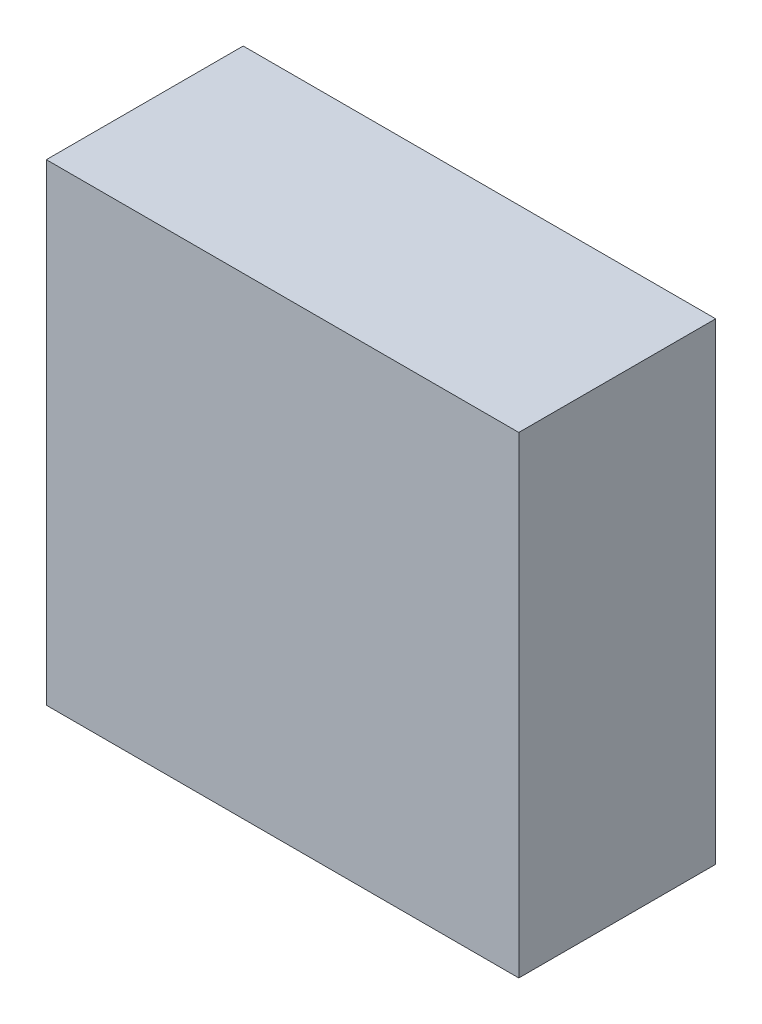
ISO-10303-21;
HEADER;
FILE_DESCRIPTION(('STEP AP214'),'2;1');
FILE_NAME('part.step','',(''),(''),'','','');
FILE_SCHEMA(('AUTOMOTIVE_DESIGN { 1 0 10303 214 1 1 1 1 }'));
ENDSEC;
DATA;
#1=APPLICATION_CONTEXT('core data for automotive mechanical design processes');
#2=APPLICATION_PROTOCOL_DEFINITION('international standard','automotive_design',2000,#1);
#3=PRODUCT_CONTEXT('',#1,'mechanical');
#4=PRODUCT('Part','Part','',(#3));
#5=PRODUCT_RELATED_PRODUCT_CATEGORY('part','',(#4));
#6=PRODUCT_DEFINITION_FORMATION('','',#4);
#7=PRODUCT_DEFINITION_CONTEXT('part definition',#1,'design');
#8=PRODUCT_DEFINITION('design','',#6,#7);
#9=PRODUCT_DEFINITION_SHAPE('','',#8);
#10=(LENGTH_UNIT() NAMED_UNIT(*) SI_UNIT(.MILLI.,.METRE.));
#11=(NAMED_UNIT(*) PLANE_ANGLE_UNIT() SI_UNIT($,.RADIAN.));
#12=(NAMED_UNIT(*) SI_UNIT($,.STERADIAN.) SOLID_ANGLE_UNIT());
#13=UNCERTAINTY_MEASURE_WITH_UNIT(LENGTH_MEASURE(1.E-05),#10,'distance_accuracy_value','');
#14=(GEOMETRIC_REPRESENTATION_CONTEXT(3) GLOBAL_UNCERTAINTY_ASSIGNED_CONTEXT((#13)) GLOBAL_UNIT_ASSIGNED_CONTEXT((#10,
#11,#12)) REPRESENTATION_CONTEXT('',''));
#15=CARTESIAN_POINT('',(0.,0.,0.));
#16=DIRECTION('',(0.,0.,1.));
#17=DIRECTION('',(1.,0.,0.));
#18=AXIS2_PLACEMENT_3D('',#15,#16,#17);
#19=CARTESIAN_POINT('',(0.,0.,25.));
#20=DIRECTION('',(1.,0.,0.));
#21=DIRECTION('',(0.,0.,-1.));
#22=AXIS2_PLACEMENT_3D('',#19,#20,#21);
#23=PLANE('',#22);
#24=DIRECTION('',(0.,-1.,0.));
#25=VECTOR('',#24,1.);
#26=CARTESIAN_POINT('',(0.,0.,0.));
#27=LINE('',#26,#25);
#28=CARTESIAN_POINT('',(0.,60.,0.));
#29=VERTEX_POINT('',#28);
#30=CARTESIAN_POINT('',(0.,0.,0.));
#31=VERTEX_POINT('',#30);
#32=EDGE_CURVE('E107',#29,#31,#27,.T.);
#33=ORIENTED_EDGE('',*,*,#32,.T.);
#34=DIRECTION('',(0.,0.,-1.));
#35=VECTOR('',#34,1.);
#36=CARTESIAN_POINT('',(0.,0.,25.));
#37=LINE('',#36,#35);
#38=CARTESIAN_POINT('',(0.,0.,25.));
#39=VERTEX_POINT('',#38);
#40=EDGE_CURVE('E11',#39,#31,#37,.T.);
#41=ORIENTED_EDGE('',*,*,#40,.F.);
#42=DIRECTION('',(0.,-1.,0.));
#43=VECTOR('',#42,1.);
#44=CARTESIAN_POINT('',(0.,0.,25.));
#45=LINE('',#44,#43);
#46=CARTESIAN_POINT('',(0.,60.,25.));
#47=VERTEX_POINT('',#46);
#48=EDGE_CURVE('E91',#47,#39,#45,.T.);
#49=ORIENTED_EDGE('',*,*,#48,.F.);
#50=DIRECTION('',(0.,0.,-1.));
#51=VECTOR('',#50,1.);
#52=CARTESIAN_POINT('',(0.,60.,25.));
#53=LINE('',#52,#51);
#54=EDGE_CURVE('E103',#47,#29,#53,.T.);
#55=ORIENTED_EDGE('',*,*,#54,.T.);
#56=EDGE_LOOP('',(#33,#41,#49,#55));
#57=FACE_BOUND('',#56,.T.);
#58=ADVANCED_FACE('F39',(#57),#23,.F.);
#59=CARTESIAN_POINT('',(0.,0.,25.));
#60=DIRECTION('',(0.,1.,0.));
#61=DIRECTION('',(0.,0.,1.));
#62=AXIS2_PLACEMENT_3D('',#59,#60,#61);
#63=PLANE('',#62);
#64=DIRECTION('',(1.,0.,0.));
#65=VECTOR('',#64,1.);
#66=CARTESIAN_POINT('',(0.,0.,0.));
#67=LINE('',#66,#65);
#68=CARTESIAN_POINT('',(60.,0.,0.));
#69=VERTEX_POINT('',#68);
#70=EDGE_CURVE('E96',#31,#69,#67,.T.);
#71=ORIENTED_EDGE('',*,*,#70,.T.);
#72=DIRECTION('',(0.,0.,-1.));
#73=VECTOR('',#72,1.);
#74=CARTESIAN_POINT('',(60.,0.,25.));
#75=LINE('',#74,#73);
#76=CARTESIAN_POINT('',(60.,0.,25.));
#77=VERTEX_POINT('',#76);
#78=EDGE_CURVE('E48',#77,#69,#75,.T.);
#79=ORIENTED_EDGE('',*,*,#78,.F.);
#80=DIRECTION('',(1.,0.,0.));
#81=VECTOR('',#80,1.);
#82=CARTESIAN_POINT('',(0.,0.,25.));
#83=LINE('',#82,#81);
#84=EDGE_CURVE('E86',#39,#77,#83,.T.);
#85=ORIENTED_EDGE('',*,*,#84,.F.);
#86=ORIENTED_EDGE('',*,*,#40,.T.);
#87=EDGE_LOOP('',(#71,#79,#85,#86));
#88=FACE_BOUND('',#87,.T.);
#89=ADVANCED_FACE('F95',(#88),#63,.F.);
#90=CARTESIAN_POINT('',(60.,0.,25.));
#91=DIRECTION('',(-1.,0.,0.));
#92=DIRECTION('',(0.,0.,1.));
#93=AXIS2_PLACEMENT_3D('',#90,#91,#92);
#94=PLANE('',#93);
#95=DIRECTION('',(0.,1.,0.));
#96=VECTOR('',#95,1.);
#97=CARTESIAN_POINT('',(60.,0.,0.));
#98=LINE('',#97,#96);
#99=CARTESIAN_POINT('',(60.,60.,0.));
#100=VERTEX_POINT('',#99);
#101=EDGE_CURVE('E73',#69,#100,#98,.T.);
#102=ORIENTED_EDGE('',*,*,#101,.T.);
#103=DIRECTION('',(0.,0.,-1.));
#104=VECTOR('',#103,1.);
#105=CARTESIAN_POINT('',(60.,60.,25.));
#106=LINE('',#105,#104);
#107=CARTESIAN_POINT('',(60.,60.,25.));
#108=VERTEX_POINT('',#107);
#109=EDGE_CURVE('E98',#108,#100,#106,.T.);
#110=ORIENTED_EDGE('',*,*,#109,.F.);
#111=DIRECTION('',(0.,1.,0.));
#112=VECTOR('',#111,1.);
#113=CARTESIAN_POINT('',(60.,0.,25.));
#114=LINE('',#113,#112);
#115=EDGE_CURVE('E89',#77,#108,#114,.T.);
#116=ORIENTED_EDGE('',*,*,#115,.F.);
#117=ORIENTED_EDGE('',*,*,#78,.T.);
#118=EDGE_LOOP('',(#102,#110,#116,#117));
#119=FACE_BOUND('',#118,.T.);
#120=ADVANCED_FACE('F99',(#119),#94,.F.);
#121=CARTESIAN_POINT('',(0.,60.,25.));
#122=DIRECTION('',(0.,-1.,0.));
#123=DIRECTION('',(0.,0.,-1.));
#124=AXIS2_PLACEMENT_3D('',#121,#122,#123);
#125=PLANE('',#124);
#126=DIRECTION('',(-1.,0.,0.));
#127=VECTOR('',#126,1.);
#128=CARTESIAN_POINT('',(0.,60.,0.));
#129=LINE('',#128,#127);
#130=EDGE_CURVE('E79',#100,#29,#129,.T.);
#131=ORIENTED_EDGE('',*,*,#130,.T.);
#132=ORIENTED_EDGE('',*,*,#54,.F.);
#133=DIRECTION('',(-1.,0.,0.));
#134=VECTOR('',#133,1.);
#135=CARTESIAN_POINT('',(0.,60.,25.));
#136=LINE('',#135,#134);
#137=EDGE_CURVE('E56',#108,#47,#136,.T.);
#138=ORIENTED_EDGE('',*,*,#137,.F.);
#139=ORIENTED_EDGE('',*,*,#109,.T.);
#140=EDGE_LOOP('',(#131,#132,#138,#139));
#141=FACE_BOUND('',#140,.T.);
#142=ADVANCED_FACE('F120',(#141),#125,.F.);
#143=CARTESIAN_POINT('',(0.,0.,25.));
#144=DIRECTION('',(0.,0.,-1.));
#145=DIRECTION('',(-1.,0.,0.));
#146=AXIS2_PLACEMENT_3D('',#143,#144,#145);
#147=PLANE('',#146);
#148=ORIENTED_EDGE('',*,*,#48,.T.);
#149=ORIENTED_EDGE('',*,*,#84,.T.);
#150=ORIENTED_EDGE('',*,*,#115,.T.);
#151=ORIENTED_EDGE('',*,*,#137,.T.);
#152=EDGE_LOOP('',(#148,#149,#150,#151));
#153=FACE_BOUND('',#152,.T.);
#154=ADVANCED_FACE('F87',(#153),#147,.F.);
#155=CARTESIAN_POINT('',(0.,0.,0.));
#156=DIRECTION('',(0.,0.,-1.));
#157=DIRECTION('',(-1.,0.,0.));
#158=AXIS2_PLACEMENT_3D('',#155,#156,#157);
#159=PLANE('',#158);
#160=ORIENTED_EDGE('',*,*,#32,.F.);
#161=ORIENTED_EDGE('',*,*,#130,.F.);
#162=ORIENTED_EDGE('',*,*,#101,.F.);
#163=ORIENTED_EDGE('',*,*,#70,.F.);
#164=EDGE_LOOP('',(#160,#161,#162,#163));
#165=FACE_BOUND('',#164,.T.);
#166=ADVANCED_FACE('F123',(#165),#159,.T.);
#167=CLOSED_SHELL('',(#58,#89,#120,#142,#154,#166));
#168=MANIFOLD_SOLID_BREP('B2',#167);
#169=ADVANCED_BREP_SHAPE_REPRESENTATION('',(#18,#168),#14);
#170=SHAPE_DEFINITION_REPRESENTATION(#9,#169);
ENDSEC;
END-ISO-10303-21;
